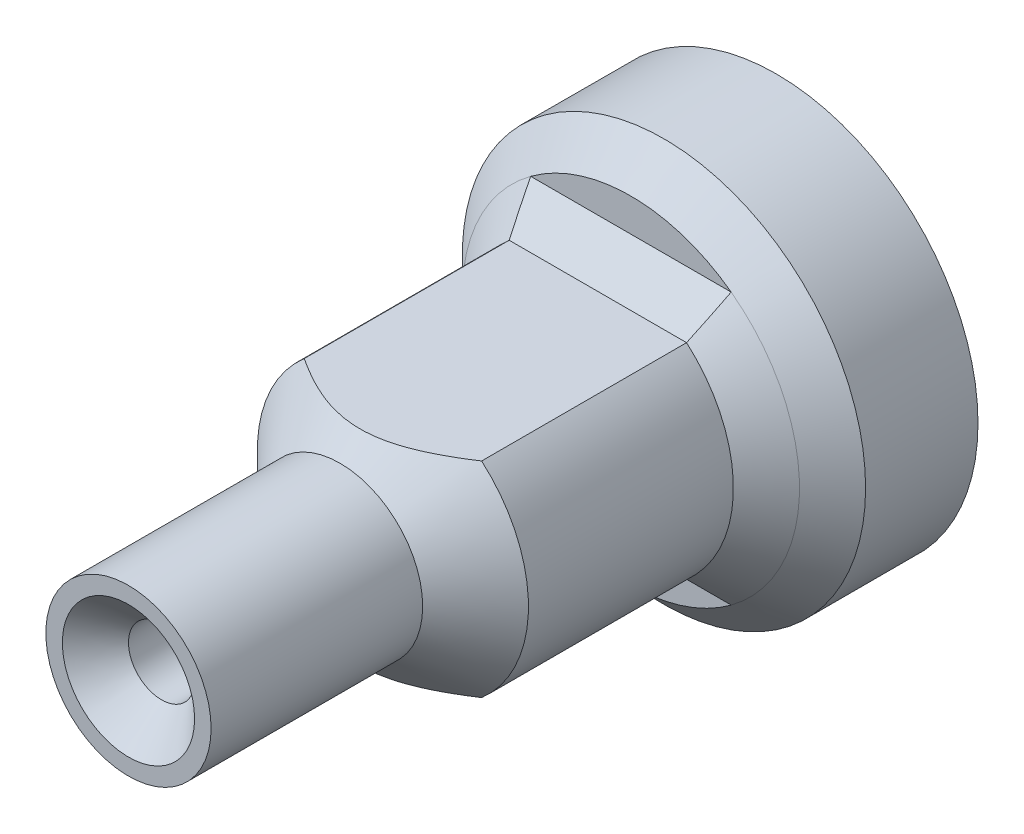
ISO-10303-21;
HEADER;
FILE_DESCRIPTION(('STEP AP214'),'2;1');
FILE_NAME('part.step','',(''),(''),'','','');
FILE_SCHEMA(('AUTOMOTIVE_DESIGN { 1 0 10303 214 1 1 1 1 }'));
ENDSEC;
DATA;
#1=APPLICATION_CONTEXT('core data for automotive mechanical design processes');
#2=APPLICATION_PROTOCOL_DEFINITION('international standard','automotive_design',2000,#1);
#3=PRODUCT_CONTEXT('',#1,'mechanical');
#4=PRODUCT('Part','Part','',(#3));
#5=PRODUCT_RELATED_PRODUCT_CATEGORY('part','',(#4));
#6=PRODUCT_DEFINITION_FORMATION('','',#4);
#7=PRODUCT_DEFINITION_CONTEXT('part definition',#1,'design');
#8=PRODUCT_DEFINITION('design','',#6,#7);
#9=PRODUCT_DEFINITION_SHAPE('','',#8);
#10=(LENGTH_UNIT() NAMED_UNIT(*) SI_UNIT(.MILLI.,.METRE.));
#11=(NAMED_UNIT(*) PLANE_ANGLE_UNIT() SI_UNIT($,.RADIAN.));
#12=(NAMED_UNIT(*) SI_UNIT($,.STERADIAN.) SOLID_ANGLE_UNIT());
#13=UNCERTAINTY_MEASURE_WITH_UNIT(LENGTH_MEASURE(1.E-05),#10,'distance_accuracy_value','');
#14=(GEOMETRIC_REPRESENTATION_CONTEXT(3) GLOBAL_UNCERTAINTY_ASSIGNED_CONTEXT((#13)) GLOBAL_UNIT_ASSIGNED_CONTEXT((#10,
#11,#12)) REPRESENTATION_CONTEXT('',''));
#15=CARTESIAN_POINT('',(0.,0.,0.));
#16=DIRECTION('',(0.,0.,1.));
#17=DIRECTION('',(1.,0.,0.));
#18=AXIS2_PLACEMENT_3D('',#15,#16,#17);
#19=CARTESIAN_POINT('',(0.,0.,4.4));
#20=DIRECTION('',(0.,0.,1.));
#21=DIRECTION('',(1.,0.,0.));
#22=AXIS2_PLACEMENT_3D('',#19,#20,#21);
#23=PLANE('',#22);
#24=DIRECTION('',(-1.,0.,0.));
#25=VECTOR('',#24,1.);
#26=CARTESIAN_POINT('',(0.,-4.10000000000001,4.4));
#27=LINE('',#26,#25);
#28=CARTESIAN_POINT('',(3.03315017762062,-4.10000000000001,4.4));
#29=VERTEX_POINT('',#28);
#30=CARTESIAN_POINT('',(-3.03315017762062,-4.10000000000001,4.4));
#31=VERTEX_POINT('',#30);
#32=EDGE_CURVE('E226',#29,#31,#27,.T.);
#33=ORIENTED_EDGE('',*,*,#32,.T.);
#34=CARTESIAN_POINT('',(0.,0.,4.4));
#35=DIRECTION('',(0.,0.,1.));
#36=DIRECTION('',(1.,0.,0.));
#37=AXIS2_PLACEMENT_3D('',#34,#35,#36);
#38=CIRCLE('',#37,5.10000000000001);
#39=EDGE_CURVE('E228',#31,#29,#38,.T.);
#40=ORIENTED_EDGE('',*,*,#39,.T.);
#41=EDGE_LOOP('',(#33,#40));
#42=FACE_BOUND('',#41,.T.);
#43=ADVANCED_FACE('F67',(#42),#23,.T.);
#44=DIRECTION('',(1.,0.,0.));
#45=VECTOR('',#44,1.);
#46=CARTESIAN_POINT('',(2.68328157299975,4.10000000000001,4.4));
#47=LINE('',#46,#45);
#48=CARTESIAN_POINT('',(-3.03315017762062,4.10000000000001,4.4));
#49=VERTEX_POINT('',#48);
#50=CARTESIAN_POINT('',(3.03315017762062,4.10000000000001,4.4));
#51=VERTEX_POINT('',#50);
#52=EDGE_CURVE('E221',#49,#51,#47,.T.);
#53=ORIENTED_EDGE('',*,*,#52,.T.);
#54=CARTESIAN_POINT('',(0.,0.,4.4));
#55=DIRECTION('',(0.,0.,1.));
#56=DIRECTION('',(1.,0.,0.));
#57=AXIS2_PLACEMENT_3D('',#54,#55,#56);
#58=CIRCLE('',#57,5.10000000000001);
#59=EDGE_CURVE('E223',#51,#49,#58,.T.);
#60=ORIENTED_EDGE('',*,*,#59,.T.);
#61=EDGE_LOOP('',(#53,#60));
#62=FACE_BOUND('',#61,.T.);
#63=ADVANCED_FACE('F336',(#62),#23,.T.);
#64=CARTESIAN_POINT('',(0.,0.,1.7));
#65=DIRECTION('',(0.,0.,-1.));
#66=DIRECTION('',(-1.,0.,0.));
#67=AXIS2_PLACEMENT_3D('',#64,#65,#66);
#68=CYLINDRICAL_SURFACE('',#67,4.6);
#69=CARTESIAN_POINT('',(0.,0.,1.7));
#70=DIRECTION('',(0.,0.,1.));
#71=DIRECTION('',(1.,0.,0.));
#72=AXIS2_PLACEMENT_3D('',#69,#70,#71);
#73=CIRCLE('',#72,4.6);
#74=CARTESIAN_POINT('',(4.6,0.,1.7));
#75=VERTEX_POINT('',#74);
#76=EDGE_CURVE('E212',#75,#75,#73,.T.);
#77=ORIENTED_EDGE('',*,*,#76,.T.);
#78=EDGE_LOOP('',(#77));
#79=FACE_BOUND('',#78,.T.);
#80=CARTESIAN_POINT('',(0.,0.,0.));
#81=DIRECTION('',(0.,0.,1.));
#82=DIRECTION('',(1.,0.,0.));
#83=AXIS2_PLACEMENT_3D('',#80,#81,#82);
#84=CIRCLE('',#83,4.6);
#85=CARTESIAN_POINT('',(4.6,0.,0.));
#86=VERTEX_POINT('',#85);
#87=EDGE_CURVE('E215',#86,#86,#84,.T.);
#88=ORIENTED_EDGE('',*,*,#87,.F.);
#89=EDGE_LOOP('',(#88));
#90=FACE_BOUND('',#89,.T.);
#91=ADVANCED_FACE('F343',(#79,#90),#68,.F.);
#92=CARTESIAN_POINT('',(0.,0.,1.7));
#93=DIRECTION('',(0.,0.,-1.));
#94=DIRECTION('',(-1.,0.,0.));
#95=AXIS2_PLACEMENT_3D('',#92,#93,#94);
#96=CYLINDRICAL_SURFACE('',#95,6.1);
#97=CARTESIAN_POINT('',(0.,0.,3.4));
#98=DIRECTION('',(0.,0.,1.));
#99=DIRECTION('',(1.,0.,0.));
#100=AXIS2_PLACEMENT_3D('',#97,#98,#99);
#101=CIRCLE('',#100,6.1);
#102=CARTESIAN_POINT('',(6.1,0.,3.4));
#103=VERTEX_POINT('',#102);
#104=EDGE_CURVE('E231',#103,#103,#101,.F.);
#105=ORIENTED_EDGE('',*,*,#104,.T.);
#106=EDGE_LOOP('',(#105));
#107=FACE_BOUND('',#106,.T.);
#108=CARTESIAN_POINT('',(0.,0.,0.));
#109=DIRECTION('',(0.,0.,1.));
#110=DIRECTION('',(1.,0.,0.));
#111=AXIS2_PLACEMENT_3D('',#108,#109,#110);
#112=CIRCLE('',#111,6.1);
#113=CARTESIAN_POINT('',(6.1,0.,0.));
#114=VERTEX_POINT('',#113);
#115=EDGE_CURVE('E218',#114,#114,#112,.T.);
#116=ORIENTED_EDGE('',*,*,#115,.T.);
#117=EDGE_LOOP('',(#116));
#118=FACE_BOUND('',#117,.T.);
#119=ADVANCED_FACE('F356',(#107,#118),#96,.T.);
#120=CARTESIAN_POINT('',(0.,0.,0.));
#121=DIRECTION('',(0.,0.,1.));
#122=DIRECTION('',(1.,0.,0.));
#123=AXIS2_PLACEMENT_3D('',#120,#121,#122);
#124=PLANE('',#123);
#125=ORIENTED_EDGE('',*,*,#87,.T.);
#126=EDGE_LOOP('',(#125));
#127=FACE_BOUND('',#126,.T.);
#128=ORIENTED_EDGE('',*,*,#115,.F.);
#129=EDGE_LOOP('',(#128));
#130=FACE_BOUND('',#129,.T.);
#131=ADVANCED_FACE('F352',(#127,#130),#124,.F.);
#132=CARTESIAN_POINT('',(0.,0.,1.7));
#133=DIRECTION('',(0.,0.,1.));
#134=DIRECTION('',(1.,0.,0.));
#135=AXIS2_PLACEMENT_3D('',#132,#133,#134);
#136=PLANE('',#135);
#137=CARTESIAN_POINT('',(0.,0.,1.7));
#138=DIRECTION('',(0.,0.,1.));
#139=DIRECTION('',(1.,0.,0.));
#140=AXIS2_PLACEMENT_3D('',#137,#138,#139);
#141=CIRCLE('',#140,2.6);
#142=CARTESIAN_POINT('',(2.6,0.,1.7));
#143=VERTEX_POINT('',#142);
#144=EDGE_CURVE('E201',#143,#143,#141,.T.);
#145=ORIENTED_EDGE('',*,*,#144,.T.);
#146=EDGE_LOOP('',(#145));
#147=FACE_BOUND('',#146,.T.);
#148=ORIENTED_EDGE('',*,*,#76,.F.);
#149=EDGE_LOOP('',(#148));
#150=FACE_BOUND('',#149,.T.);
#151=ADVANCED_FACE('F349',(#147,#150),#136,.F.);
#152=CARTESIAN_POINT('',(0.,0.,4.4));
#153=DIRECTION('',(0.,0.,-1.));
#154=DIRECTION('',(-1.,0.,0.));
#155=AXIS2_PLACEMENT_3D('',#152,#153,#154);
#156=CYLINDRICAL_SURFACE('',#155,2.6);
#157=CARTESIAN_POINT('',(0.,0.,6.99999999999999));
#158=DIRECTION('',(0.,0.707106781186547,0.707106781186549));
#159=DIRECTION('',(0.,0.707106781186549,-0.707106781186547));
#160=AXIS2_PLACEMENT_3D('',#157,#158,#159);
#161=ELLIPSE('',#160,3.67695526217004,2.6);
#162=CARTESIAN_POINT('',(2.04939015319192,1.6,5.4));
#163=VERTEX_POINT('',#162);
#164=CARTESIAN_POINT('',(0.,2.6,4.4));
#165=VERTEX_POINT('',#164);
#166=EDGE_CURVE('E89',#163,#165,#161,.T.);
#167=ORIENTED_EDGE('',*,*,#166,.T.);
#168=CARTESIAN_POINT('',(0.,0.,6.99999999999999));
#169=DIRECTION('',(0.,0.707106781186547,0.707106781186549));
#170=DIRECTION('',(0.,0.707106781186549,-0.707106781186547));
#171=AXIS2_PLACEMENT_3D('',#168,#169,#170);
#172=ELLIPSE('',#171,3.67695526217004,2.6);
#173=CARTESIAN_POINT('',(-2.04939015319192,1.6,5.4));
#174=VERTEX_POINT('',#173);
#175=EDGE_CURVE('E422',#165,#174,#172,.T.);
#176=ORIENTED_EDGE('',*,*,#175,.T.);
#177=DIRECTION('',(0.,0.,-1.));
#178=VECTOR('',#177,1.);
#179=CARTESIAN_POINT('',(-2.04939015319192,1.6,10.6));
#180=LINE('',#179,#178);
#181=CARTESIAN_POINT('',(-2.04939015319192,1.6,10.6));
#182=VERTEX_POINT('',#181);
#183=EDGE_CURVE('E203',#182,#174,#180,.T.);
#184=ORIENTED_EDGE('',*,*,#183,.F.);
#185=CARTESIAN_POINT('',(0.,0.,10.6));
#186=DIRECTION('',(0.,0.,1.));
#187=DIRECTION('',(1.,0.,0.));
#188=AXIS2_PLACEMENT_3D('',#185,#186,#187);
#189=CIRCLE('',#188,2.6);
#190=CARTESIAN_POINT('',(-2.04939015319192,-1.6,10.6));
#191=VERTEX_POINT('',#190);
#192=EDGE_CURVE('E183',#191,#182,#189,.F.);
#193=ORIENTED_EDGE('',*,*,#192,.F.);
#194=DIRECTION('',(0.,0.,-1.));
#195=VECTOR('',#194,1.);
#196=CARTESIAN_POINT('',(-2.04939015319192,-1.6,10.6));
#197=LINE('',#196,#195);
#198=CARTESIAN_POINT('',(-2.04939015319192,-1.6,5.4));
#199=VERTEX_POINT('',#198);
#200=EDGE_CURVE('E206',#191,#199,#197,.T.);
#201=ORIENTED_EDGE('',*,*,#200,.T.);
#202=CARTESIAN_POINT('',(0.,0.,7.00000000000001));
#203=DIRECTION('',(0.,0.70710678118655,-0.707106781186545));
#204=DIRECTION('',(0.,-0.707106781186545,-0.70710678118655));
#205=AXIS2_PLACEMENT_3D('',#202,#203,#204);
#206=ELLIPSE('',#205,3.67695526217006,2.6);
#207=CARTESIAN_POINT('',(0.,-2.6,4.4));
#208=VERTEX_POINT('',#207);
#209=EDGE_CURVE('E96',#199,#208,#206,.F.);
#210=ORIENTED_EDGE('',*,*,#209,.T.);
#211=CARTESIAN_POINT('',(0.,0.,7.00000000000001));
#212=DIRECTION('',(0.,0.70710678118655,-0.707106781186545));
#213=DIRECTION('',(0.,-0.707106781186545,-0.70710678118655));
#214=AXIS2_PLACEMENT_3D('',#211,#212,#213);
#215=ELLIPSE('',#214,3.67695526217006,2.6);
#216=CARTESIAN_POINT('',(2.04939015319192,-1.6,5.4));
#217=VERTEX_POINT('',#216);
#218=EDGE_CURVE('E413',#208,#217,#215,.F.);
#219=ORIENTED_EDGE('',*,*,#218,.T.);
#220=DIRECTION('',(0.,0.,-1.));
#221=VECTOR('',#220,1.);
#222=CARTESIAN_POINT('',(2.04939015319192,-1.6,10.6));
#223=LINE('',#222,#221);
#224=CARTESIAN_POINT('',(2.04939015319192,-1.6,10.6));
#225=VERTEX_POINT('',#224);
#226=EDGE_CURVE('E198',#225,#217,#223,.T.);
#227=ORIENTED_EDGE('',*,*,#226,.F.);
#228=CARTESIAN_POINT('',(2.04939015319192,1.6,10.6));
#229=VERTEX_POINT('',#228);
#230=EDGE_CURVE('E177',#229,#225,#189,.F.);
#231=ORIENTED_EDGE('',*,*,#230,.F.);
#232=DIRECTION('',(0.,0.,-1.));
#233=VECTOR('',#232,1.);
#234=CARTESIAN_POINT('',(2.04939015319192,1.6,10.6));
#235=LINE('',#234,#233);
#236=EDGE_CURVE('E194',#229,#163,#235,.T.);
#237=ORIENTED_EDGE('',*,*,#236,.T.);
#238=EDGE_LOOP('',(#167,#176,#184,#193,#201,#210,#219,#227,#231,#237));
#239=FACE_BOUND('',#238,.T.);
#240=ORIENTED_EDGE('',*,*,#144,.F.);
#241=EDGE_LOOP('',(#240));
#242=FACE_BOUND('',#241,.T.);
#243=ADVANCED_FACE('F347',(#239,#242),#156,.F.);
#244=CARTESIAN_POINT('',(0.,3.1,10.6));
#245=DIRECTION('',(0.,1.,0.));
#246=DIRECTION('',(0.,0.,1.));
#247=AXIS2_PLACEMENT_3D('',#244,#245,#246);
#248=PLANE('',#247);
#249=DIRECTION('',(0.,0.,-1.));
#250=VECTOR('',#249,1.);
#251=CARTESIAN_POINT('',(2.68328157299975,3.1,10.6));
#252=LINE('',#251,#250);
#253=CARTESIAN_POINT('',(2.68328157299975,3.1,11.6));
#254=VERTEX_POINT('',#253);
#255=CARTESIAN_POINT('',(2.68328157299975,3.1,5.40000000000002));
#256=VERTEX_POINT('',#255);
#257=EDGE_CURVE('E195',#254,#256,#252,.T.);
#258=ORIENTED_EDGE('',*,*,#257,.T.);
#259=DIRECTION('',(-1.,0.,0.));
#260=VECTOR('',#259,1.);
#261=CARTESIAN_POINT('',(-2.68328157299975,3.1,5.40000000000002));
#262=LINE('',#261,#260);
#263=CARTESIAN_POINT('',(-2.68328157299975,3.1,5.40000000000002));
#264=VERTEX_POINT('',#263);
#265=EDGE_CURVE('E239',#256,#264,#262,.T.);
#266=ORIENTED_EDGE('',*,*,#265,.T.);
#267=DIRECTION('',(0.,0.,-1.));
#268=VECTOR('',#267,1.);
#269=CARTESIAN_POINT('',(-2.68328157299975,3.1,10.6));
#270=LINE('',#269,#268);
#271=CARTESIAN_POINT('',(-2.68328157299975,3.1,11.6));
#272=VERTEX_POINT('',#271);
#273=EDGE_CURVE('E174',#272,#264,#270,.T.);
#274=ORIENTED_EDGE('',*,*,#273,.F.);
#275=CARTESIAN_POINT('',(-2.68328157299974,3.09999999999999,11.6));
#276=CARTESIAN_POINT('',(-2.61838758322265,3.1,11.6424651576906));
#277=CARTESIAN_POINT('',(-2.55309563034613,3.1,11.6843212483961));
#278=CARTESIAN_POINT('',(-2.42160185710209,3.1,11.766614964839));
#279=CARTESIAN_POINT('',(-2.35539981093887,3.1,11.8070522293892));
#280=CARTESIAN_POINT('',(-2.15465795033237,3.1,11.9262888429094));
#281=CARTESIAN_POINT('',(-2.01861214361449,3.1,12.0025954731037));
#282=CARTESIAN_POINT('',(-1.73796428376559,3.1,12.1481386900084));
#283=CARTESIAN_POINT('',(-1.59322980121367,3.1,12.2171229618571));
#284=CARTESIAN_POINT('',(-1.29830000649831,3.1,12.3417554670589));
#285=CARTESIAN_POINT('',(-1.14811652430886,3.1,12.3974308076474));
#286=CARTESIAN_POINT('',(-0.903453718612227,3.1,12.4722138666123));
#287=CARTESIAN_POINT('',(-0.810723297041177,3.1,12.4970404298842));
#288=CARTESIAN_POINT('',(-0.623546055690494,3.1,12.5392241438526));
#289=CARTESIAN_POINT('',(-0.529099190510718,3.1,12.5565810966763));
#290=CARTESIAN_POINT('',(-0.340131080504393,3.1,12.582783157268));
#291=CARTESIAN_POINT('',(-0.245623366712671,3.1,12.5917245216692));
#292=CARTESIAN_POINT('',(-0.0561851368264243,3.1,12.6009339884287));
#293=CARTESIAN_POINT('',(0.0387453490895932,3.1,12.6012027002433));
#294=CARTESIAN_POINT('',(0.228273328945147,3.1,12.5930500466396));
#295=CARTESIAN_POINT('',(0.322870633610366,3.1,12.5846243555051));
#296=CARTESIAN_POINT('',(0.510963034513585,3.1,12.5595560671489));
#297=CARTESIAN_POINT('',(0.604458003787452,3.1,12.5429125327028));
#298=CARTESIAN_POINT('',(0.790860818487678,3.1,12.5020175716837));
#299=CARTESIAN_POINT('',(0.883749932259145,3.1,12.477681876792));
#300=CARTESIAN_POINT('',(1.0675479582879,3.1,12.4225055522742));
#301=CARTESIAN_POINT('',(1.15845687049943,3.1,12.3916649224978));
#302=CARTESIAN_POINT('',(1.37695347621194,3.1,12.3100512782491));
#303=CARTESIAN_POINT('',(1.5034678000605,3.1,12.2564155297523));
#304=CARTESIAN_POINT('',(1.75258751498671,3.1,12.140592527006));
#305=CARTESIAN_POINT('',(1.87518904978449,3.1,12.0783971389768));
#306=CARTESIAN_POINT('',(2.11373703653037,3.1,11.9492542408844));
#307=CARTESIAN_POINT('',(2.22977362634669,3.1,11.8824718940583));
#308=CARTESIAN_POINT('',(2.40153771100399,3.1,11.7788634196018));
#309=CARTESIAN_POINT('',(2.45834205108394,3.1,11.7438000569073));
#310=CARTESIAN_POINT('',(2.57129000278554,3.1,11.6726419270408));
#311=CARTESIAN_POINT('',(2.62743370912224,3.1,11.6365473103272));
#312=CARTESIAN_POINT('',(2.68328157299974,3.1,11.6));
#313=B_SPLINE_CURVE_WITH_KNOTS('',3,(#275,#276,#277,#278,#279,#280,#281,#282,#283,#284,#285,
#286,#287,#288,#289,#290,#291,#292,#293,#294,#295,#296,#297,#298,#299,#300,#301,#302,#303,#304,
#305,#306,#307,#308,#309,#310,#311,#312),.UNSPECIFIED.,.F.,.F.,(4,2,2,2,2,2,2,2,2,2,2,2,2,2,2,2,
2,2,4),(0.,0.232652873000401,0.465364548402418,0.933052529092363,1.41360947395564,
1.89317913206697,2.18091193569716,2.46865236100364,2.75306014999404,3.03744795265613,
3.32197731470343,3.60653913410891,3.89433320209145,4.18212727672386,4.59392326319345,
5.00611329508932,5.40760889961445,5.60786404912262,5.80809012938958),.UNSPECIFIED.);
#314=EDGE_CURVE('E12',#272,#254,#313,.T.);
#315=ORIENTED_EDGE('',*,*,#314,.T.);
#316=EDGE_LOOP('',(#258,#266,#274,#315));
#317=FACE_BOUND('',#316,.T.);
#318=ADVANCED_FACE('F392',(#317),#248,.T.);
#319=CARTESIAN_POINT('',(0.,0.,10.6));
#320=DIRECTION('',(0.,0.,-1.));
#321=DIRECTION('',(-1.,0.,0.));
#322=AXIS2_PLACEMENT_3D('',#319,#320,#321);
#323=CYLINDRICAL_SURFACE('',#322,4.1);
#324=ORIENTED_EDGE('',*,*,#273,.T.);
#325=CARTESIAN_POINT('',(0.,0.,5.40000000000002));
#326=DIRECTION('',(0.,0.,1.));
#327=DIRECTION('',(1.,0.,0.));
#328=AXIS2_PLACEMENT_3D('',#325,#326,#327);
#329=CIRCLE('',#328,4.1);
#330=CARTESIAN_POINT('',(-2.68328157299975,-3.1,5.40000000000002));
#331=VERTEX_POINT('',#330);
#332=EDGE_CURVE('E173',#264,#331,#329,.T.);
#333=ORIENTED_EDGE('',*,*,#332,.T.);
#334=DIRECTION('',(0.,0.,-1.));
#335=VECTOR('',#334,1.);
#336=CARTESIAN_POINT('',(-2.68328157299975,-3.1,10.6));
#337=LINE('',#336,#335);
#338=CARTESIAN_POINT('',(-2.68328157299975,-3.1,11.6));
#339=VERTEX_POINT('',#338);
#340=EDGE_CURVE('E157',#339,#331,#337,.T.);
#341=ORIENTED_EDGE('',*,*,#340,.F.);
#342=CARTESIAN_POINT('',(0.,0.,11.6));
#343=DIRECTION('',(0.,0.,1.));
#344=DIRECTION('',(1.,0.,0.));
#345=AXIS2_PLACEMENT_3D('',#342,#343,#344);
#346=CIRCLE('',#345,4.1);
#347=EDGE_CURVE('E170',#272,#339,#346,.T.);
#348=ORIENTED_EDGE('',*,*,#347,.F.);
#349=EDGE_LOOP('',(#324,#333,#341,#348));
#350=FACE_BOUND('',#349,.T.);
#351=ADVANCED_FACE('F169',(#350),#323,.T.);
#352=CARTESIAN_POINT('',(0.,-3.1,10.6));
#353=DIRECTION('',(0.,1.,0.));
#354=DIRECTION('',(0.,0.,1.));
#355=AXIS2_PLACEMENT_3D('',#352,#353,#354);
#356=PLANE('',#355);
#357=ORIENTED_EDGE('',*,*,#340,.T.);
#358=DIRECTION('',(1.,0.,0.));
#359=VECTOR('',#358,1.);
#360=CARTESIAN_POINT('',(0.,-3.1,5.40000000000002));
#361=LINE('',#360,#359);
#362=CARTESIAN_POINT('',(2.68328157299975,-3.1,5.40000000000002));
#363=VERTEX_POINT('',#362);
#364=EDGE_CURVE('E237',#331,#363,#361,.T.);
#365=ORIENTED_EDGE('',*,*,#364,.T.);
#366=DIRECTION('',(0.,0.,-1.));
#367=VECTOR('',#366,1.);
#368=CARTESIAN_POINT('',(2.68328157299975,-3.1,10.6));
#369=LINE('',#368,#367);
#370=CARTESIAN_POINT('',(2.68328157299975,-3.1,11.6));
#371=VERTEX_POINT('',#370);
#372=EDGE_CURVE('E160',#371,#363,#369,.T.);
#373=ORIENTED_EDGE('',*,*,#372,.F.);
#374=CARTESIAN_POINT('',(2.68328157299973,-3.1,11.6));
#375=CARTESIAN_POINT('',(2.61838758322264,-3.1,11.6424651576906));
#376=CARTESIAN_POINT('',(2.55309563034613,-3.1,11.6843212483961));
#377=CARTESIAN_POINT('',(2.42160185710208,-3.1,11.766614964839));
#378=CARTESIAN_POINT('',(2.35539981093886,-3.1,11.8070522293892));
#379=CARTESIAN_POINT('',(2.15465795033236,-3.1,11.9262888429094));
#380=CARTESIAN_POINT('',(2.01861214361448,-3.1,12.0025954731037));
#381=CARTESIAN_POINT('',(1.73796428376559,-3.1,12.1481386900084));
#382=CARTESIAN_POINT('',(1.59322980121366,-3.1,12.2171229618571));
#383=CARTESIAN_POINT('',(1.29830000649831,-3.1,12.3417554670589));
#384=CARTESIAN_POINT('',(1.14811652430886,-3.1,12.3974308076474));
#385=CARTESIAN_POINT('',(0.903453718612225,-3.1,12.4722138666123));
#386=CARTESIAN_POINT('',(0.810723297041175,-3.1,12.4970404298842));
#387=CARTESIAN_POINT('',(0.623546055690492,-3.1,12.5392241438526));
#388=CARTESIAN_POINT('',(0.529099190510717,-3.1,12.5565810966763));
#389=CARTESIAN_POINT('',(0.340131080504392,-3.1,12.582783157268));
#390=CARTESIAN_POINT('',(0.24562336671267,-3.1,12.5917245216692));
#391=CARTESIAN_POINT('',(0.0561851368264235,-3.1,12.6009339884287));
#392=CARTESIAN_POINT('',(-0.0387453490895939,-3.1,12.6012027002433));
#393=CARTESIAN_POINT('',(-0.228273328945147,-3.1,12.5930500466396));
#394=CARTESIAN_POINT('',(-0.322870633610366,-3.1,12.5846243555051));
#395=CARTESIAN_POINT('',(-0.510963034513585,-3.1,12.5595560671489));
#396=CARTESIAN_POINT('',(-0.604458003787452,-3.1,12.5429125327028));
#397=CARTESIAN_POINT('',(-0.790860818487677,-3.1,12.5020175716837));
#398=CARTESIAN_POINT('',(-0.883749932259144,-3.1,12.477681876792));
#399=CARTESIAN_POINT('',(-1.0675479582879,-3.1,12.4225055522742));
#400=CARTESIAN_POINT('',(-1.15845687049943,-3.1,12.3916649224978));
#401=CARTESIAN_POINT('',(-1.37695347621194,-3.1,12.3100512782491));
#402=CARTESIAN_POINT('',(-1.5034678000605,-3.1,12.2564155297523));
#403=CARTESIAN_POINT('',(-1.75258751498671,-3.1,12.140592527006));
#404=CARTESIAN_POINT('',(-1.87518904978449,-3.1,12.0783971389768));
#405=CARTESIAN_POINT('',(-2.11373703653038,-3.1,11.9492542408844));
#406=CARTESIAN_POINT('',(-2.22977362634669,-3.1,11.8824718940583));
#407=CARTESIAN_POINT('',(-2.40153771100399,-3.1,11.7788634196018));
#408=CARTESIAN_POINT('',(-2.45834205108394,-3.1,11.7438000569073));
#409=CARTESIAN_POINT('',(-2.57129000278554,-3.1,11.6726419270408));
#410=CARTESIAN_POINT('',(-2.62743370912224,-3.1,11.6365473103272));
#411=CARTESIAN_POINT('',(-2.68328157299974,-3.1,11.6));
#412=B_SPLINE_CURVE_WITH_KNOTS('',3,(#374,#375,#376,#377,#378,#379,#380,#381,#382,#383,#384,
#385,#386,#387,#388,#389,#390,#391,#392,#393,#394,#395,#396,#397,#398,#399,#400,#401,#402,#403,
#404,#405,#406,#407,#408,#409,#410,#411),.UNSPECIFIED.,.F.,.F.,(4,2,2,2,2,2,2,2,2,2,2,2,2,2,2,2,
2,2,4),(0.,0.232652873000401,0.465364548402417,0.933052529092359,1.41360947395563,
1.89317913206696,2.18091193569716,2.46865236100364,2.75306014999403,3.03744795265613,
3.32197731470342,3.6065391341089,3.89433320209144,4.18212727672385,4.59392326319344,
5.00611329508931,5.40760889961445,5.60786404912262,5.80809012938958),.UNSPECIFIED.);
#413=EDGE_CURVE('E82',#371,#339,#412,.T.);
#414=ORIENTED_EDGE('',*,*,#413,.T.);
#415=EDGE_LOOP('',(#357,#365,#373,#414));
#416=FACE_BOUND('',#415,.T.);
#417=ADVANCED_FACE('F156',(#416),#356,.F.);
#418=CARTESIAN_POINT('',(0.,-1.6,10.6));
#419=DIRECTION('',(0.,1.,0.));
#420=DIRECTION('',(0.,0.,1.));
#421=AXIS2_PLACEMENT_3D('',#418,#419,#420);
#422=PLANE('',#421);
#423=ORIENTED_EDGE('',*,*,#226,.T.);
#424=DIRECTION('',(-1.,0.,0.));
#425=VECTOR('',#424,1.);
#426=CARTESIAN_POINT('',(-2.04939015319192,-1.6,5.4));
#427=LINE('',#426,#425);
#428=EDGE_CURVE('E242',#217,#199,#427,.T.);
#429=ORIENTED_EDGE('',*,*,#428,.T.);
#430=ORIENTED_EDGE('',*,*,#200,.F.);
#431=DIRECTION('',(1.,0.,0.));
#432=VECTOR('',#431,1.);
#433=CARTESIAN_POINT('',(0.,-1.6,10.6));
#434=LINE('',#433,#432);
#435=EDGE_CURVE('E181',#191,#225,#434,.T.);
#436=ORIENTED_EDGE('',*,*,#435,.T.);
#437=EDGE_LOOP('',(#423,#429,#430,#436));
#438=FACE_BOUND('',#437,.T.);
#439=ADVANCED_FACE('F403',(#438),#422,.T.);
#440=CARTESIAN_POINT('',(0.,1.6,10.6));
#441=DIRECTION('',(0.,1.,0.));
#442=DIRECTION('',(0.,0.,1.));
#443=AXIS2_PLACEMENT_3D('',#440,#441,#442);
#444=PLANE('',#443);
#445=ORIENTED_EDGE('',*,*,#183,.T.);
#446=DIRECTION('',(1.,0.,0.));
#447=VECTOR('',#446,1.);
#448=CARTESIAN_POINT('',(0.,1.6,5.4));
#449=LINE('',#448,#447);
#450=EDGE_CURVE('E414',#174,#163,#449,.T.);
#451=ORIENTED_EDGE('',*,*,#450,.T.);
#452=ORIENTED_EDGE('',*,*,#236,.F.);
#453=DIRECTION('',(1.,0.,0.));
#454=VECTOR('',#453,1.);
#455=CARTESIAN_POINT('',(0.,1.6,10.6));
#456=LINE('',#455,#454);
#457=EDGE_CURVE('E191',#182,#229,#456,.T.);
#458=ORIENTED_EDGE('',*,*,#457,.F.);
#459=EDGE_LOOP('',(#445,#451,#452,#458));
#460=FACE_BOUND('',#459,.T.);
#461=ADVANCED_FACE('F401',(#460),#444,.F.);
#462=ORIENTED_EDGE('',*,*,#372,.T.);
#463=CARTESIAN_POINT('',(0.,0.,5.40000000000002));
#464=DIRECTION('',(0.,0.,1.));
#465=DIRECTION('',(1.,0.,0.));
#466=AXIS2_PLACEMENT_3D('',#463,#464,#465);
#467=CIRCLE('',#466,4.1);
#468=EDGE_CURVE('E234',#363,#256,#467,.T.);
#469=ORIENTED_EDGE('',*,*,#468,.T.);
#470=ORIENTED_EDGE('',*,*,#257,.F.);
#471=CARTESIAN_POINT('',(0.,0.,11.6));
#472=DIRECTION('',(0.,0.,1.));
#473=DIRECTION('',(1.,0.,0.));
#474=AXIS2_PLACEMENT_3D('',#471,#472,#473);
#475=CIRCLE('',#474,4.1);
#476=EDGE_CURVE('E178',#371,#254,#475,.T.);
#477=ORIENTED_EDGE('',*,*,#476,.F.);
#478=EDGE_LOOP('',(#462,#469,#470,#477));
#479=FACE_BOUND('',#478,.T.);
#480=ADVANCED_FACE('F389',(#479),#323,.T.);
#481=CARTESIAN_POINT('',(0.,0.,10.6));
#482=DIRECTION('',(0.,0.,1.));
#483=DIRECTION('',(1.,0.,0.));
#484=AXIS2_PLACEMENT_3D('',#481,#482,#483);
#485=PLANE('',#484);
#486=ORIENTED_EDGE('',*,*,#457,.T.);
#487=ORIENTED_EDGE('',*,*,#230,.T.);
#488=ORIENTED_EDGE('',*,*,#435,.F.);
#489=ORIENTED_EDGE('',*,*,#192,.T.);
#490=EDGE_LOOP('',(#486,#487,#488,#489));
#491=FACE_BOUND('',#490,.T.);
#492=ADVANCED_FACE('F455',(#491),#485,.F.);
#493=CARTESIAN_POINT('',(0.,4.10000000000001,4.4));
#494=DIRECTION('',(0.,0.707106781186551,0.707106781186544));
#495=DIRECTION('',(-1.,0.,0.));
#496=AXIS2_PLACEMENT_3D('',#493,#494,#495);
#497=PLANE('',#496);
#498=CARTESIAN_POINT('',(-2.68328157299975,3.1,5.40000000000002));
#499=CARTESIAN_POINT('',(-2.71421819801649,3.18301784127955,5.31698215872047));
#500=CARTESIAN_POINT('',(-2.74465865157146,3.26612761852869,5.23387238147133));
#501=CARTESIAN_POINT('',(-2.80462429591378,3.43250767941219,5.06749232058782));
#502=CARTESIAN_POINT('',(-2.83414953319829,3.51577795466347,4.98422204533654));
#503=CARTESIAN_POINT('',(-2.89236457204003,3.68246299469834,4.81753700530167));
#504=CARTESIAN_POINT('',(-2.92105438466299,3.76587775755258,4.73412224244743));
#505=CARTESIAN_POINT('',(-2.9776641551174,3.93284233647619,4.56715766352382));
#506=CARTESIAN_POINT('',(-3.00558407372162,4.0163921591983,4.48360784080171));
#507=CARTESIAN_POINT('',(-3.03315017762062,4.10000000000001,4.4));
#508=B_SPLINE_CURVE_WITH_KNOTS('',3,(#498,#499,#500,#501,#502,#503,#504,#505,#506,#507),
.UNSPECIFIED.,.F.,.F.,(4,2,2,2,4),(0.,0.36423544859756,0.728452361944027,1.09266444880947,
1.45689505865155),.UNSPECIFIED.);
#509=EDGE_CURVE('E256',#264,#49,#508,.T.);
#510=ORIENTED_EDGE('',*,*,#509,.F.);
#511=ORIENTED_EDGE('',*,*,#265,.F.);
#512=CARTESIAN_POINT('',(2.68328157299975,3.1,5.40000000000002));
#513=CARTESIAN_POINT('',(2.71421819801648,3.18301784127955,5.31698215872047));
#514=CARTESIAN_POINT('',(2.74465865157146,3.26612761852869,5.23387238147133));
#515=CARTESIAN_POINT('',(2.80462429591378,3.43250767941219,5.06749232058782));
#516=CARTESIAN_POINT('',(2.83414953319829,3.51577795466347,4.98422204533654));
#517=CARTESIAN_POINT('',(2.89236457204003,3.68246299469834,4.81753700530167));
#518=CARTESIAN_POINT('',(2.92105438466299,3.76587775755258,4.73412224244743));
#519=CARTESIAN_POINT('',(2.9776641551174,3.93284233647619,4.56715766352382));
#520=CARTESIAN_POINT('',(3.00558407372162,4.0163921591983,4.48360784080171));
#521=CARTESIAN_POINT('',(3.03315017762062,4.10000000000001,4.4));
#522=B_SPLINE_CURVE_WITH_KNOTS('',3,(#512,#513,#514,#515,#516,#517,#518,#519,#520,#521),
.UNSPECIFIED.,.F.,.F.,(4,2,2,2,4),(0.,0.36423544859756,0.728452361944027,1.09266444880947,
1.45689505865156),.UNSPECIFIED.);
#523=EDGE_CURVE('E287',#51,#256,#522,.F.);
#524=ORIENTED_EDGE('',*,*,#523,.F.);
#525=ORIENTED_EDGE('',*,*,#52,.F.);
#526=EDGE_LOOP('',(#510,#511,#524,#525));
#527=FACE_BOUND('',#526,.T.);
#528=ADVANCED_FACE('F275',(#527),#497,.T.);
#529=CARTESIAN_POINT('',(0.,-3.1,5.40000000000002));
#530=DIRECTION('',(0.,0.707106781186551,-0.707106781186544));
#531=DIRECTION('',(1.,0.,0.));
#532=AXIS2_PLACEMENT_3D('',#529,#530,#531);
#533=PLANE('',#532);
#534=CARTESIAN_POINT('',(3.03315017762062,-4.10000000000001,4.4));
#535=CARTESIAN_POINT('',(3.00558407372162,-4.0163921591983,4.48360784080171));
#536=CARTESIAN_POINT('',(2.9776641551174,-3.93284233647619,4.56715766352382));
#537=CARTESIAN_POINT('',(2.92105438466299,-3.76587775755258,4.73412224244743));
#538=CARTESIAN_POINT('',(2.89236457204003,-3.68246299469834,4.81753700530167));
#539=CARTESIAN_POINT('',(2.83414953319829,-3.51577795466347,4.98422204533654));
#540=CARTESIAN_POINT('',(2.80462429591378,-3.43250767941219,5.06749232058782));
#541=CARTESIAN_POINT('',(2.74465865157146,-3.26612761852869,5.23387238147133));
#542=CARTESIAN_POINT('',(2.71421819801649,-3.18301784127955,5.31698215872047));
#543=CARTESIAN_POINT('',(2.68328157299975,-3.1,5.40000000000002));
#544=B_SPLINE_CURVE_WITH_KNOTS('',3,(#534,#535,#536,#537,#538,#539,#540,#541,#542,#543),
.UNSPECIFIED.,.F.,.F.,(4,2,2,2,4),(0.,0.364230609842088,0.728442696707528,1.092659610054,
1.45689505865156),.UNSPECIFIED.);
#545=EDGE_CURVE('E184',#363,#29,#544,.F.);
#546=ORIENTED_EDGE('',*,*,#545,.F.);
#547=ORIENTED_EDGE('',*,*,#364,.F.);
#548=CARTESIAN_POINT('',(-3.03315017762062,-4.10000000000001,4.4));
#549=CARTESIAN_POINT('',(-3.00558407372162,-4.0163921591983,4.48360784080171));
#550=CARTESIAN_POINT('',(-2.9776641551174,-3.93284233647619,4.56715766352382));
#551=CARTESIAN_POINT('',(-2.92105438466299,-3.76587775755258,4.73412224244743));
#552=CARTESIAN_POINT('',(-2.89236457204003,-3.68246299469834,4.81753700530167));
#553=CARTESIAN_POINT('',(-2.83414953319829,-3.51577795466347,4.98422204533654));
#554=CARTESIAN_POINT('',(-2.80462429591378,-3.43250767941219,5.06749232058782));
#555=CARTESIAN_POINT('',(-2.74465865157146,-3.26612761852869,5.23387238147133));
#556=CARTESIAN_POINT('',(-2.71421819801649,-3.18301784127955,5.31698215872047));
#557=CARTESIAN_POINT('',(-2.68328157299975,-3.1,5.40000000000002));
#558=B_SPLINE_CURVE_WITH_KNOTS('',3,(#548,#549,#550,#551,#552,#553,#554,#555,#556,#557),
.UNSPECIFIED.,.F.,.F.,(4,2,2,2,4),(0.,0.364230609842088,0.728442696707527,1.09265961005399,
1.45689505865155),.UNSPECIFIED.);
#559=EDGE_CURVE('E247',#31,#331,#558,.T.);
#560=ORIENTED_EDGE('',*,*,#559,.F.);
#561=ORIENTED_EDGE('',*,*,#32,.F.);
#562=EDGE_LOOP('',(#546,#547,#560,#561));
#563=FACE_BOUND('',#562,.T.);
#564=ADVANCED_FACE('F268',(#563),#533,.F.);
#565=CARTESIAN_POINT('',(0.,0.,5.40000000000002));
#566=DIRECTION('',(0.,0.,-1.));
#567=DIRECTION('',(-1.,0.,0.));
#568=AXIS2_PLACEMENT_3D('',#565,#566,#567);
#569=CONICAL_SURFACE('',#568,4.1,0.785398163397444);
#570=ORIENTED_EDGE('',*,*,#468,.F.);
#571=ORIENTED_EDGE('',*,*,#545,.T.);
#572=CARTESIAN_POINT('',(0.,0.,4.4));
#573=DIRECTION('',(0.,0.,1.));
#574=DIRECTION('',(1.,0.,0.));
#575=AXIS2_PLACEMENT_3D('',#572,#573,#574);
#576=CIRCLE('',#575,5.10000000000001);
#577=EDGE_CURVE('E245',#51,#29,#576,.F.);
#578=ORIENTED_EDGE('',*,*,#577,.F.);
#579=ORIENTED_EDGE('',*,*,#523,.T.);
#580=EDGE_LOOP('',(#570,#571,#578,#579));
#581=FACE_BOUND('',#580,.T.);
#582=ADVANCED_FACE('F274',(#581),#569,.T.);
#583=CARTESIAN_POINT('',(0.,0.,5.40000000000002));
#584=DIRECTION('',(0.,0.,-1.));
#585=DIRECTION('',(-1.,0.,0.));
#586=AXIS2_PLACEMENT_3D('',#583,#584,#585);
#587=CONICAL_SURFACE('',#586,4.1,0.785398163397444);
#588=ORIENTED_EDGE('',*,*,#332,.F.);
#589=ORIENTED_EDGE('',*,*,#509,.T.);
#590=CARTESIAN_POINT('',(0.,0.,4.4));
#591=DIRECTION('',(0.,0.,1.));
#592=DIRECTION('',(1.,0.,0.));
#593=AXIS2_PLACEMENT_3D('',#590,#591,#592);
#594=CIRCLE('',#593,5.10000000000001);
#595=EDGE_CURVE('E243',#31,#49,#594,.F.);
#596=ORIENTED_EDGE('',*,*,#595,.F.);
#597=ORIENTED_EDGE('',*,*,#559,.T.);
#598=EDGE_LOOP('',(#588,#589,#596,#597));
#599=FACE_BOUND('',#598,.T.);
#600=ADVANCED_FACE('F264',(#599),#587,.T.);
#601=CARTESIAN_POINT('',(0.,0.,4.4));
#602=DIRECTION('',(0.,0.,-1.));
#603=DIRECTION('',(-1.,0.,0.));
#604=AXIS2_PLACEMENT_3D('',#601,#602,#603);
#605=CONICAL_SURFACE('',#604,5.10000000000001,0.785398163397447);
#606=ORIENTED_EDGE('',*,*,#104,.F.);
#607=EDGE_LOOP('',(#606));
#608=FACE_BOUND('',#607,.T.);
#609=ORIENTED_EDGE('',*,*,#59,.F.);
#610=ORIENTED_EDGE('',*,*,#577,.T.);
#611=ORIENTED_EDGE('',*,*,#39,.F.);
#612=ORIENTED_EDGE('',*,*,#595,.T.);
#613=EDGE_LOOP('',(#609,#610,#611,#612));
#614=FACE_BOUND('',#613,.T.);
#615=ADVANCED_FACE('F310',(#608,#614),#605,.T.);
#616=CARTESIAN_POINT('',(0.,-2.6,4.4));
#617=DIRECTION('',(0.,0.70710678118655,-0.707106781186545));
#618=DIRECTION('',(-1.,0.,0.));
#619=AXIS2_PLACEMENT_3D('',#616,#617,#618);
#620=PLANE('',#619);
#621=ORIENTED_EDGE('',*,*,#209,.F.);
#622=ORIENTED_EDGE('',*,*,#428,.F.);
#623=ORIENTED_EDGE('',*,*,#218,.F.);
#624=EDGE_LOOP('',(#621,#622,#623));
#625=FACE_BOUND('',#624,.T.);
#626=ADVANCED_FACE('F301',(#625),#620,.T.);
#627=CARTESIAN_POINT('',(0.,1.6,5.4));
#628=DIRECTION('',(0.,0.707106781186547,0.707106781186549));
#629=DIRECTION('',(1.,0.,0.));
#630=AXIS2_PLACEMENT_3D('',#627,#628,#629);
#631=PLANE('',#630);
#632=ORIENTED_EDGE('',*,*,#450,.F.);
#633=ORIENTED_EDGE('',*,*,#175,.F.);
#634=ORIENTED_EDGE('',*,*,#166,.F.);
#635=EDGE_LOOP('',(#632,#633,#634));
#636=FACE_BOUND('',#635,.T.);
#637=ADVANCED_FACE('F309',(#636),#631,.F.);
#638=CARTESIAN_POINT('',(0.,0.,19.6));
#639=DIRECTION('',(0.,0.,-1.));
#640=DIRECTION('',(-1.,0.,0.));
#641=AXIS2_PLACEMENT_3D('',#638,#639,#640);
#642=CYLINDRICAL_SURFACE('',#641,1.);
#643=CARTESIAN_POINT('',(0.,0.,18.6));
#644=DIRECTION('',(0.,0.,1.));
#645=DIRECTION('',(1.,0.,0.));
#646=AXIS2_PLACEMENT_3D('',#643,#644,#645);
#647=CIRCLE('',#646,1.);
#648=CARTESIAN_POINT('',(1.,0.,18.6));
#649=VERTEX_POINT('',#648);
#650=EDGE_CURVE('E427',#649,#649,#647,.T.);
#651=ORIENTED_EDGE('',*,*,#650,.T.);
#652=EDGE_LOOP('',(#651));
#653=FACE_BOUND('',#652,.T.);
#654=CARTESIAN_POINT('',(0.,0.,11.6));
#655=DIRECTION('',(0.,0.,1.));
#656=DIRECTION('',(1.,0.,0.));
#657=AXIS2_PLACEMENT_3D('',#654,#655,#656);
#658=CIRCLE('',#657,1.);
#659=CARTESIAN_POINT('',(1.,0.,11.6));
#660=VERTEX_POINT('',#659);
#661=EDGE_CURVE('E424',#660,#660,#658,.F.);
#662=ORIENTED_EDGE('',*,*,#661,.T.);
#663=EDGE_LOOP('',(#662));
#664=FACE_BOUND('',#663,.T.);
#665=ADVANCED_FACE('F316',(#653,#664),#642,.F.);
#666=CARTESIAN_POINT('',(0.,0.,19.6));
#667=DIRECTION('',(0.,0.,-1.));
#668=DIRECTION('',(-1.,0.,0.));
#669=AXIS2_PLACEMENT_3D('',#666,#667,#668);
#670=CYLINDRICAL_SURFACE('',#669,2.5);
#671=CARTESIAN_POINT('',(0.,0.,13.2));
#672=DIRECTION('',(0.,0.,1.));
#673=DIRECTION('',(1.,0.,0.));
#674=AXIS2_PLACEMENT_3D('',#671,#672,#673);
#675=CIRCLE('',#674,2.5);
#676=CARTESIAN_POINT('',(2.5,0.,13.2));
#677=VERTEX_POINT('',#676);
#678=EDGE_CURVE('E165',#677,#677,#675,.T.);
#679=ORIENTED_EDGE('',*,*,#678,.T.);
#680=EDGE_LOOP('',(#679));
#681=FACE_BOUND('',#680,.T.);
#682=CARTESIAN_POINT('',(0.,0.,19.6));
#683=DIRECTION('',(0.,0.,1.));
#684=DIRECTION('',(1.,0.,0.));
#685=AXIS2_PLACEMENT_3D('',#682,#683,#684);
#686=CIRCLE('',#685,2.5);
#687=CARTESIAN_POINT('',(2.5,0.,19.6));
#688=VERTEX_POINT('',#687);
#689=EDGE_CURVE('E187',#688,#688,#686,.T.);
#690=ORIENTED_EDGE('',*,*,#689,.F.);
#691=EDGE_LOOP('',(#690));
#692=FACE_BOUND('',#691,.T.);
#693=ADVANCED_FACE('F440',(#681,#692),#670,.T.);
#694=CARTESIAN_POINT('',(0.,0.,19.6));
#695=DIRECTION('',(0.,0.,1.));
#696=DIRECTION('',(1.,0.,0.));
#697=AXIS2_PLACEMENT_3D('',#694,#695,#696);
#698=PLANE('',#697);
#699=CARTESIAN_POINT('',(0.,0.,19.6));
#700=DIRECTION('',(0.,0.,1.));
#701=DIRECTION('',(1.,0.,0.));
#702=AXIS2_PLACEMENT_3D('',#699,#700,#701);
#703=CIRCLE('',#702,2.00000000000001);
#704=CARTESIAN_POINT('',(2.00000000000001,0.,19.6));
#705=VERTEX_POINT('',#704);
#706=EDGE_CURVE('E430',#705,#705,#703,.F.);
#707=ORIENTED_EDGE('',*,*,#706,.T.);
#708=EDGE_LOOP('',(#707));
#709=FACE_BOUND('',#708,.T.);
#710=ORIENTED_EDGE('',*,*,#689,.T.);
#711=EDGE_LOOP('',(#710));
#712=FACE_BOUND('',#711,.T.);
#713=ADVANCED_FACE('F330',(#709,#712),#698,.T.);
#714=CARTESIAN_POINT('',(0.,0.,11.6));
#715=DIRECTION('',(0.,0.,1.));
#716=DIRECTION('',(1.,0.,0.));
#717=AXIS2_PLACEMENT_3D('',#714,#715,#716);
#718=PLANE('',#717);
#719=ORIENTED_EDGE('',*,*,#661,.F.);
#720=EDGE_LOOP('',(#719));
#721=FACE_BOUND('',#720,.T.);
#722=ADVANCED_FACE('F322',(#721),#718,.T.);
#723=CARTESIAN_POINT('',(0.,0.,18.6));
#724=DIRECTION('',(0.,0.,1.));
#725=DIRECTION('',(1.,0.,0.));
#726=AXIS2_PLACEMENT_3D('',#723,#724,#725);
#727=CONICAL_SURFACE('',#726,1.,0.78539816339745);
#728=ORIENTED_EDGE('',*,*,#706,.F.);
#729=EDGE_LOOP('',(#728));
#730=FACE_BOUND('',#729,.T.);
#731=ORIENTED_EDGE('',*,*,#650,.F.);
#732=EDGE_LOOP('',(#731));
#733=FACE_BOUND('',#732,.T.);
#734=ADVANCED_FACE('F318',(#730,#733),#727,.F.);
#735=CARTESIAN_POINT('',(0.,0.,13.2));
#736=DIRECTION('',(0.,0.,-1.));
#737=DIRECTION('',(-1.,0.,0.));
#738=AXIS2_PLACEMENT_3D('',#735,#736,#737);
#739=CONICAL_SURFACE('',#738,2.5,0.785398163397444);
#740=ORIENTED_EDGE('',*,*,#413,.F.);
#741=ORIENTED_EDGE('',*,*,#476,.T.);
#742=ORIENTED_EDGE('',*,*,#314,.F.);
#743=ORIENTED_EDGE('',*,*,#347,.T.);
#744=EDGE_LOOP('',(#740,#741,#742,#743));
#745=FACE_BOUND('',#744,.T.);
#746=ORIENTED_EDGE('',*,*,#678,.F.);
#747=EDGE_LOOP('',(#746));
#748=FACE_BOUND('',#747,.T.);
#749=ADVANCED_FACE('F70',(#745,#748),#739,.T.);
#750=CLOSED_SHELL('',(#43,#63,#91,#119,#131,#151,#243,#318,#351,#417,#439,#461,#480,#492,#528,
#564,#582,#600,#615,#626,#637,#665,#693,#713,#722,#734,#749));
#751=MANIFOLD_SOLID_BREP('B2',#750);
#752=ADVANCED_BREP_SHAPE_REPRESENTATION('',(#18,#751),#14);
#753=SHAPE_DEFINITION_REPRESENTATION(#9,#752);
ENDSEC;
END-ISO-10303-21;
